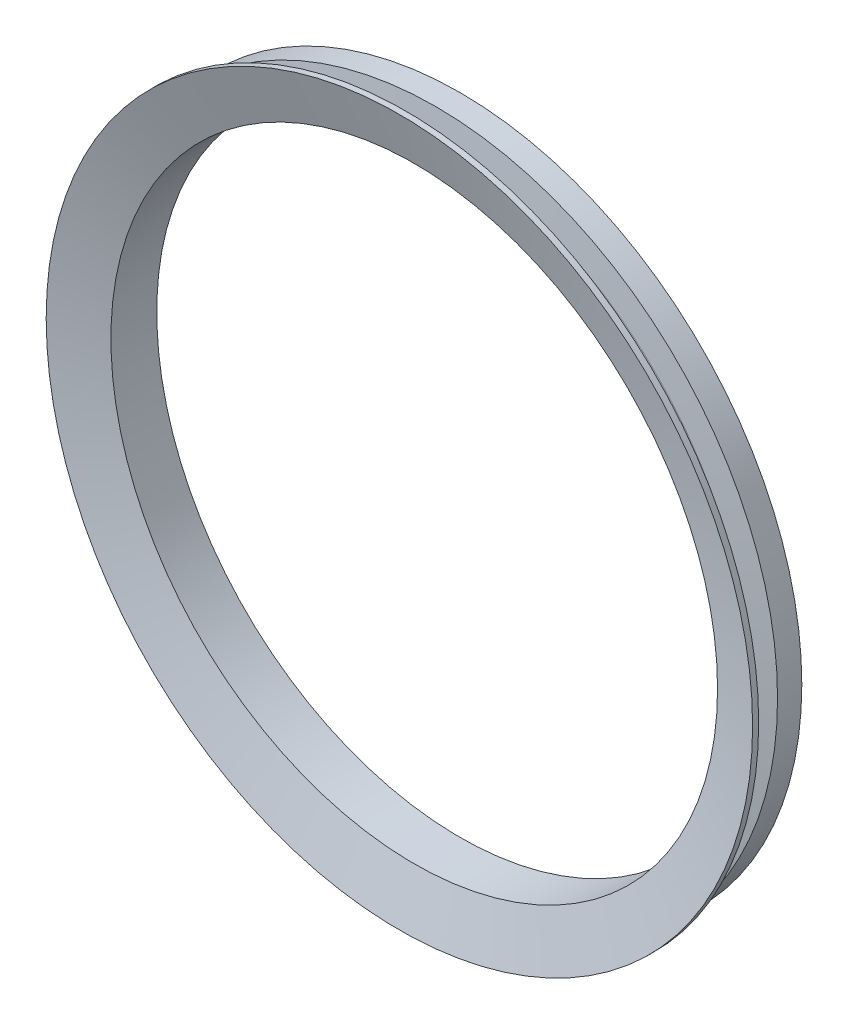
ISO-10303-21;
HEADER;
FILE_DESCRIPTION(('STEP AP214'),'2;1');
FILE_NAME('part.step','',(''),(''),'','','');
FILE_SCHEMA(('AUTOMOTIVE_DESIGN { 1 0 10303 214 1 1 1 1 }'));
ENDSEC;
DATA;
#1=APPLICATION_CONTEXT('core data for automotive mechanical design processes');
#2=APPLICATION_PROTOCOL_DEFINITION('international standard','automotive_design',2000,#1);
#3=PRODUCT_CONTEXT('',#1,'mechanical');
#4=PRODUCT('Part','Part','',(#3));
#5=PRODUCT_RELATED_PRODUCT_CATEGORY('part','',(#4));
#6=PRODUCT_DEFINITION_FORMATION('','',#4);
#7=PRODUCT_DEFINITION_CONTEXT('part definition',#1,'design');
#8=PRODUCT_DEFINITION('design','',#6,#7);
#9=PRODUCT_DEFINITION_SHAPE('','',#8);
#10=(LENGTH_UNIT() NAMED_UNIT(*) SI_UNIT(.MILLI.,.METRE.));
#11=(NAMED_UNIT(*) PLANE_ANGLE_UNIT() SI_UNIT($,.RADIAN.));
#12=(NAMED_UNIT(*) SI_UNIT($,.STERADIAN.) SOLID_ANGLE_UNIT());
#13=UNCERTAINTY_MEASURE_WITH_UNIT(LENGTH_MEASURE(1.E-05),#10,'distance_accuracy_value','');
#14=(GEOMETRIC_REPRESENTATION_CONTEXT(3) GLOBAL_UNCERTAINTY_ASSIGNED_CONTEXT((#13)) GLOBAL_UNIT_ASSIGNED_CONTEXT((#10,
#11,#12)) REPRESENTATION_CONTEXT('',''));
#15=CARTESIAN_POINT('',(0.,0.,0.));
#16=DIRECTION('',(0.,0.,1.));
#17=DIRECTION('',(1.,0.,0.));
#18=AXIS2_PLACEMENT_3D('',#15,#16,#17);
#19=CARTESIAN_POINT('',(0.,0.,9.));
#20=DIRECTION('',(0.,0.,1.));
#21=DIRECTION('',(1.,0.,0.));
#22=AXIS2_PLACEMENT_3D('',#19,#20,#21);
#23=CONICAL_SURFACE('',#22,52.4,1.28182091680233);
#24=CARTESIAN_POINT('',(0.,0.,6.8));
#25=DIRECTION('',(0.,0.,1.));
#26=DIRECTION('',(1.,0.,0.));
#27=AXIS2_PLACEMENT_3D('',#24,#25,#26);
#28=CIRCLE('',#27,45.);
#29=CARTESIAN_POINT('',(45.,0.,6.8));
#30=VERTEX_POINT('',#29);
#31=EDGE_CURVE('E10',#30,#30,#28,.T.);
#32=ORIENTED_EDGE('',*,*,#31,.F.);
#33=EDGE_LOOP('',(#32));
#34=FACE_BOUND('',#33,.T.);
#35=CARTESIAN_POINT('',(0.,0.,9.));
#36=DIRECTION('',(0.,0.,1.));
#37=DIRECTION('',(1.,0.,0.));
#38=AXIS2_PLACEMENT_3D('',#35,#36,#37);
#39=CIRCLE('',#38,52.4);
#40=CARTESIAN_POINT('',(52.4,0.,9.));
#41=VERTEX_POINT('',#40);
#42=EDGE_CURVE('E67',#41,#41,#39,.T.);
#43=ORIENTED_EDGE('',*,*,#42,.T.);
#44=EDGE_LOOP('',(#43));
#45=FACE_BOUND('',#44,.T.);
#46=ADVANCED_FACE('F39',(#34,#45),#23,.F.);
#47=CARTESIAN_POINT('',(0.,0.,0.));
#48=DIRECTION('',(0.,0.,1.));
#49=DIRECTION('',(1.,0.,0.));
#50=AXIS2_PLACEMENT_3D('',#47,#48,#49);
#51=CYLINDRICAL_SURFACE('',#50,45.);
#52=CARTESIAN_POINT('',(0.,0.,0.));
#53=DIRECTION('',(0.,0.,1.));
#54=DIRECTION('',(1.,0.,0.));
#55=AXIS2_PLACEMENT_3D('',#52,#53,#54);
#56=CIRCLE('',#55,45.);
#57=CARTESIAN_POINT('',(45.,0.,0.));
#58=VERTEX_POINT('',#57);
#59=EDGE_CURVE('E45',#58,#58,#56,.T.);
#60=ORIENTED_EDGE('',*,*,#59,.F.);
#61=EDGE_LOOP('',(#60));
#62=FACE_BOUND('',#61,.T.);
#63=ORIENTED_EDGE('',*,*,#31,.T.);
#64=EDGE_LOOP('',(#63));
#65=FACE_BOUND('',#64,.T.);
#66=ADVANCED_FACE('F104',(#62,#65),#51,.F.);
#67=CARTESIAN_POINT('',(0.,50.7,0.));
#68=DIRECTION('',(0.,0.,1.));
#69=DIRECTION('',(1.,0.,0.));
#70=AXIS2_PLACEMENT_3D('',#67,#68,#69);
#71=PLANE('',#70);
#72=CARTESIAN_POINT('',(0.,0.,0.));
#73=DIRECTION('',(0.,0.,1.));
#74=DIRECTION('',(1.,0.,0.));
#75=AXIS2_PLACEMENT_3D('',#72,#73,#74);
#76=CIRCLE('',#75,50.7);
#77=CARTESIAN_POINT('',(50.7,0.,0.));
#78=VERTEX_POINT('',#77);
#79=EDGE_CURVE('E49',#78,#78,#76,.T.);
#80=ORIENTED_EDGE('',*,*,#79,.F.);
#81=EDGE_LOOP('',(#80));
#82=FACE_BOUND('',#81,.T.);
#83=ORIENTED_EDGE('',*,*,#59,.T.);
#84=EDGE_LOOP('',(#83));
#85=FACE_BOUND('',#84,.T.);
#86=ADVANCED_FACE('F99',(#82,#85),#71,.F.);
#87=CARTESIAN_POINT('',(0.,0.,0.));
#88=DIRECTION('',(0.,0.,1.));
#89=DIRECTION('',(1.,0.,0.));
#90=AXIS2_PLACEMENT_3D('',#87,#88,#89);
#91=CYLINDRICAL_SURFACE('',#90,50.7);
#92=CARTESIAN_POINT('',(0.,0.,3.6));
#93=DIRECTION('',(0.,0.,1.));
#94=DIRECTION('',(1.,0.,0.));
#95=AXIS2_PLACEMENT_3D('',#92,#93,#94);
#96=CIRCLE('',#95,50.7);
#97=CARTESIAN_POINT('',(50.7,0.,3.6));
#98=VERTEX_POINT('',#97);
#99=EDGE_CURVE('E53',#98,#98,#96,.T.);
#100=ORIENTED_EDGE('',*,*,#99,.F.);
#101=EDGE_LOOP('',(#100));
#102=FACE_BOUND('',#101,.T.);
#103=ORIENTED_EDGE('',*,*,#79,.T.);
#104=EDGE_LOOP('',(#103));
#105=FACE_BOUND('',#104,.T.);
#106=ADVANCED_FACE('F93',(#102,#105),#91,.T.);
#107=CARTESIAN_POINT('',(0.,0.,3.6));
#108=DIRECTION('',(0.,0.,-1.));
#109=DIRECTION('',(-1.,0.,0.));
#110=AXIS2_PLACEMENT_3D('',#107,#108,#109);
#111=CONICAL_SURFACE('',#110,50.7,1.45876736436891);
#112=CARTESIAN_POINT('',(0.,0.,4.03037818763952));
#113=DIRECTION('',(0.,0.,1.));
#114=DIRECTION('',(1.,0.,0.));
#115=AXIS2_PLACEMENT_3D('',#112,#113,#114);
#116=CIRCLE('',#115,46.8744161098709);
#117=CARTESIAN_POINT('',(46.8744161098709,0.,4.03037818763952));
#118=VERTEX_POINT('',#117);
#119=EDGE_CURVE('E58',#118,#118,#116,.T.);
#120=ORIENTED_EDGE('',*,*,#119,.F.);
#121=EDGE_LOOP('',(#120));
#122=FACE_BOUND('',#121,.T.);
#123=ORIENTED_EDGE('',*,*,#99,.T.);
#124=EDGE_LOOP('',(#123));
#125=FACE_BOUND('',#124,.T.);
#126=ADVANCED_FACE('F87',(#122,#125),#111,.T.);
#127=CARTESIAN_POINT('',(0.,0.,5.02410950379832));
#128=DIRECTION('',(0.,0.,1.));
#129=DIRECTION('',(1.,0.,0.));
#130=AXIS2_PLACEMENT_3D('',#127,#128,#129);
#131=TOROIDAL_SURFACE('',#130,46.9862108829388,1.);
#132=CARTESIAN_POINT('',(0.,0.,5.96162487810788));
#133=DIRECTION('',(0.,0.,1.));
#134=DIRECTION('',(1.,0.,0.));
#135=AXIS2_PLACEMENT_3D('',#132,#133,#134);
#136=CIRCLE('',#135,46.6382670326796);
#137=CARTESIAN_POINT('',(46.6382670326796,0.,5.96162487810788));
#138=VERTEX_POINT('',#137);
#139=EDGE_CURVE('E61',#138,#138,#136,.T.);
#140=ORIENTED_EDGE('',*,*,#139,.F.);
#141=EDGE_LOOP('',(#140));
#142=FACE_BOUND('',#141,.T.);
#143=ORIENTED_EDGE('',*,*,#119,.T.);
#144=EDGE_LOOP('',(#143));
#145=FACE_BOUND('',#144,.T.);
#146=ADVANCED_FACE('F81',(#142,#145),#131,.F.);
#147=CARTESIAN_POINT('',(0.,0.,5.96162487810788));
#148=DIRECTION('',(0.,0.,1.));
#149=DIRECTION('',(1.,0.,0.));
#150=AXIS2_PLACEMENT_3D('',#147,#148,#149);
#151=CONICAL_SURFACE('',#150,46.6382670326796,1.21541930865455);
#152=CARTESIAN_POINT('',(0.,0.,8.1));
#153=DIRECTION('',(0.,0.,1.));
#154=DIRECTION('',(1.,0.,0.));
#155=AXIS2_PLACEMENT_3D('',#152,#153,#154);
#156=CIRCLE('',#155,52.4);
#157=CARTESIAN_POINT('',(52.4,0.,8.1));
#158=VERTEX_POINT('',#157);
#159=EDGE_CURVE('E64',#158,#158,#156,.T.);
#160=ORIENTED_EDGE('',*,*,#159,.F.);
#161=EDGE_LOOP('',(#160));
#162=FACE_BOUND('',#161,.T.);
#163=ORIENTED_EDGE('',*,*,#139,.T.);
#164=EDGE_LOOP('',(#163));
#165=FACE_BOUND('',#164,.T.);
#166=ADVANCED_FACE('F75',(#162,#165),#151,.T.);
#167=CARTESIAN_POINT('',(0.,0.,0.));
#168=DIRECTION('',(0.,0.,1.));
#169=DIRECTION('',(1.,0.,0.));
#170=AXIS2_PLACEMENT_3D('',#167,#168,#169);
#171=CYLINDRICAL_SURFACE('',#170,52.4);
#172=ORIENTED_EDGE('',*,*,#42,.F.);
#173=EDGE_LOOP('',(#172));
#174=FACE_BOUND('',#173,.T.);
#175=ORIENTED_EDGE('',*,*,#159,.T.);
#176=EDGE_LOOP('',(#175));
#177=FACE_BOUND('',#176,.T.);
#178=ADVANCED_FACE('F72',(#174,#177),#171,.T.);
#179=CLOSED_SHELL('',(#46,#66,#86,#106,#126,#146,#166,#178));
#180=MANIFOLD_SOLID_BREP('B2',#179);
#181=ADVANCED_BREP_SHAPE_REPRESENTATION('',(#18,#180),#14);
#182=SHAPE_DEFINITION_REPRESENTATION(#9,#181);
ENDSEC;
END-ISO-10303-21;
